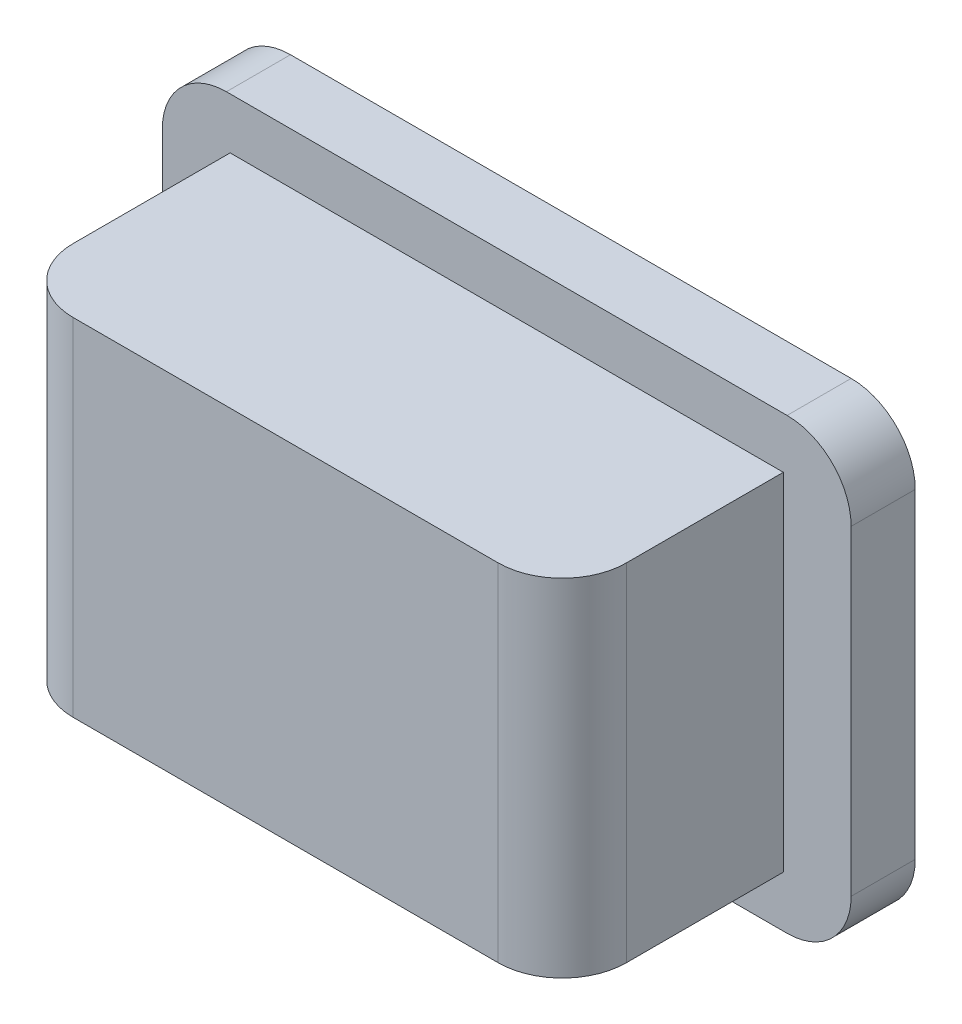
ISO-10303-21;
HEADER;
FILE_DESCRIPTION(('STEP AP214'),'2;1');
FILE_NAME('part.step','',(''),(''),'','','');
FILE_SCHEMA(('AUTOMOTIVE_DESIGN { 1 0 10303 214 1 1 1 1 }'));
ENDSEC;
DATA;
#1=APPLICATION_CONTEXT('core data for automotive mechanical design processes');
#2=APPLICATION_PROTOCOL_DEFINITION('international standard','automotive_design',2000,#1);
#3=PRODUCT_CONTEXT('',#1,'mechanical');
#4=PRODUCT('Part','Part','',(#3));
#5=PRODUCT_RELATED_PRODUCT_CATEGORY('part','',(#4));
#6=PRODUCT_DEFINITION_FORMATION('','',#4);
#7=PRODUCT_DEFINITION_CONTEXT('part definition',#1,'design');
#8=PRODUCT_DEFINITION('design','',#6,#7);
#9=PRODUCT_DEFINITION_SHAPE('','',#8);
#10=(LENGTH_UNIT() NAMED_UNIT(*) SI_UNIT(.MILLI.,.METRE.));
#11=(NAMED_UNIT(*) PLANE_ANGLE_UNIT() SI_UNIT($,.RADIAN.));
#12=(NAMED_UNIT(*) SI_UNIT($,.STERADIAN.) SOLID_ANGLE_UNIT());
#13=UNCERTAINTY_MEASURE_WITH_UNIT(LENGTH_MEASURE(1.E-05),#10,'distance_accuracy_value','');
#14=(GEOMETRIC_REPRESENTATION_CONTEXT(3) GLOBAL_UNCERTAINTY_ASSIGNED_CONTEXT((#13)) GLOBAL_UNIT_ASSIGNED_CONTEXT((#10,
#11,#12)) REPRESENTATION_CONTEXT('',''));
#15=CARTESIAN_POINT('',(0.,0.,0.));
#16=DIRECTION('',(0.,0.,1.));
#17=DIRECTION('',(1.,0.,0.));
#18=AXIS2_PLACEMENT_3D('',#15,#16,#17);
#19=CARTESIAN_POINT('',(8.74999999999987,-5.00000000000001,2.));
#20=DIRECTION('',(0.,0.,-1.));
#21=DIRECTION('',(-1.,0.,0.));
#22=AXIS2_PLACEMENT_3D('',#19,#20,#21);
#23=PLANE('',#22);
#24=CARTESIAN_POINT('',(8.74999999999987,-5.00000000000001,2.));
#25=DIRECTION('',(0.,0.,1.));
#26=DIRECTION('',(-1.,0.,0.));
#27=AXIS2_PLACEMENT_3D('',#24,#25,#26);
#28=CIRCLE('',#27,2.);
#29=CARTESIAN_POINT('',(8.74999999999986,-7.00000000000001,2.));
#30=VERTEX_POINT('',#29);
#31=CARTESIAN_POINT('',(10.7499999999999,-4.99999999999999,2.));
#32=VERTEX_POINT('',#31);
#33=EDGE_CURVE('E170',#30,#32,#28,.T.);
#34=ORIENTED_EDGE('',*,*,#33,.T.);
#35=DIRECTION('',(0.,1.,0.));
#36=VECTOR('',#35,1.);
#37=CARTESIAN_POINT('',(10.7499999999999,-4.99999999999999,2.));
#38=LINE('',#37,#36);
#39=CARTESIAN_POINT('',(10.7499999999999,4.99999999999998,2.));
#40=VERTEX_POINT('',#39);
#41=EDGE_CURVE('E173',#32,#40,#38,.T.);
#42=ORIENTED_EDGE('',*,*,#41,.T.);
#43=CARTESIAN_POINT('',(8.74999999999987,4.99999999999999,2.));
#44=DIRECTION('',(0.,0.,1.));
#45=DIRECTION('',(-1.,0.,0.));
#46=AXIS2_PLACEMENT_3D('',#43,#44,#45);
#47=CIRCLE('',#46,2.);
#48=CARTESIAN_POINT('',(8.74999999999986,6.99999999999999,2.));
#49=VERTEX_POINT('',#48);
#50=EDGE_CURVE('E176',#40,#49,#47,.T.);
#51=ORIENTED_EDGE('',*,*,#50,.T.);
#52=DIRECTION('',(-1.,0.,0.));
#53=VECTOR('',#52,1.);
#54=CARTESIAN_POINT('',(-8.75000000000008,6.99999999999999,2.));
#55=LINE('',#54,#53);
#56=CARTESIAN_POINT('',(-8.75000000000008,6.99999999999999,2.));
#57=VERTEX_POINT('',#56);
#58=EDGE_CURVE('E178',#49,#57,#55,.T.);
#59=ORIENTED_EDGE('',*,*,#58,.T.);
#60=CARTESIAN_POINT('',(-8.75000000000009,4.99999999999999,2.));
#61=DIRECTION('',(0.,0.,1.));
#62=DIRECTION('',(1.,0.,0.));
#63=AXIS2_PLACEMENT_3D('',#60,#61,#62);
#64=CIRCLE('',#63,2.);
#65=CARTESIAN_POINT('',(-10.7500000000001,4.99999999999998,2.));
#66=VERTEX_POINT('',#65);
#67=EDGE_CURVE('E180',#57,#66,#64,.T.);
#68=ORIENTED_EDGE('',*,*,#67,.T.);
#69=DIRECTION('',(0.,-1.,0.));
#70=VECTOR('',#69,1.);
#71=CARTESIAN_POINT('',(-10.7500000000001,-4.99999999999999,2.));
#72=LINE('',#71,#70);
#73=CARTESIAN_POINT('',(-10.7500000000001,-4.99999999999999,2.));
#74=VERTEX_POINT('',#73);
#75=EDGE_CURVE('E182',#66,#74,#72,.T.);
#76=ORIENTED_EDGE('',*,*,#75,.T.);
#77=CARTESIAN_POINT('',(-8.75000000000009,-5.00000000000001,2.));
#78=DIRECTION('',(0.,0.,1.));
#79=DIRECTION('',(1.,0.,0.));
#80=AXIS2_PLACEMENT_3D('',#77,#78,#79);
#81=CIRCLE('',#80,2.);
#82=CARTESIAN_POINT('',(-8.75000000000008,-7.00000000000001,2.));
#83=VERTEX_POINT('',#82);
#84=EDGE_CURVE('E184',#74,#83,#81,.T.);
#85=ORIENTED_EDGE('',*,*,#84,.T.);
#86=DIRECTION('',(1.,0.,0.));
#87=VECTOR('',#86,1.);
#88=CARTESIAN_POINT('',(-8.75000000000008,-7.00000000000001,2.));
#89=LINE('',#88,#87);
#90=EDGE_CURVE('E186',#83,#30,#89,.T.);
#91=ORIENTED_EDGE('',*,*,#90,.T.);
#92=EDGE_LOOP('',(#34,#42,#51,#59,#68,#76,#85,#91));
#93=FACE_BOUND('',#92,.T.);
#94=DIRECTION('',(0.,1.,0.));
#95=VECTOR('',#94,1.);
#96=CARTESIAN_POINT('',(8.63374956790608,-5.40437907785929,2.));
#97=LINE('',#96,#95);
#98=CARTESIAN_POINT('',(8.63374956790608,-5.40437907785929,2.));
#99=VERTEX_POINT('',#98);
#100=CARTESIAN_POINT('',(8.63374956790608,5.40437907785929,2.));
#101=VERTEX_POINT('',#100);
#102=EDGE_CURVE('E157',#99,#101,#97,.T.);
#103=ORIENTED_EDGE('',*,*,#102,.F.);
#104=DIRECTION('',(1.,0.,0.));
#105=VECTOR('',#104,1.);
#106=CARTESIAN_POINT('',(-8.63374956790608,-5.40437907785929,2.));
#107=LINE('',#106,#105);
#108=CARTESIAN_POINT('',(-8.63374956790608,-5.40437907785929,2.));
#109=VERTEX_POINT('',#108);
#110=EDGE_CURVE('E153',#109,#99,#107,.T.);
#111=ORIENTED_EDGE('',*,*,#110,.F.);
#112=DIRECTION('',(0.,-1.,0.));
#113=VECTOR('',#112,1.);
#114=CARTESIAN_POINT('',(-8.63374956790608,-5.40437907785929,2.));
#115=LINE('',#114,#113);
#116=CARTESIAN_POINT('',(-8.63374956790608,5.40437907785929,2.));
#117=VERTEX_POINT('',#116);
#118=EDGE_CURVE('E138',#117,#109,#115,.T.);
#119=ORIENTED_EDGE('',*,*,#118,.F.);
#120=DIRECTION('',(-1.,0.,0.));
#121=VECTOR('',#120,1.);
#122=CARTESIAN_POINT('',(-8.63374956790608,5.40437907785929,2.));
#123=LINE('',#122,#121);
#124=EDGE_CURVE('E150',#101,#117,#123,.T.);
#125=ORIENTED_EDGE('',*,*,#124,.F.);
#126=EDGE_LOOP('',(#103,#111,#119,#125));
#127=FACE_BOUND('',#126,.T.);
#128=ADVANCED_FACE('F34',(#93,#127),#23,.F.);
#129=CARTESIAN_POINT('',(8.74999999999987,-5.00000000000001,2.));
#130=DIRECTION('',(0.,0.,-1.));
#131=DIRECTION('',(-1.,0.,0.));
#132=AXIS2_PLACEMENT_3D('',#129,#130,#131);
#133=CYLINDRICAL_SURFACE('',#132,2.);
#134=CARTESIAN_POINT('',(8.74999999999987,-5.00000000000001,0.));
#135=DIRECTION('',(0.,0.,1.));
#136=DIRECTION('',(-1.,0.,0.));
#137=AXIS2_PLACEMENT_3D('',#134,#135,#136);
#138=CIRCLE('',#137,2.);
#139=CARTESIAN_POINT('',(8.74999999999986,-7.00000000000001,0.));
#140=VERTEX_POINT('',#139);
#141=CARTESIAN_POINT('',(10.7499999999999,-4.99999999999999,0.));
#142=VERTEX_POINT('',#141);
#143=EDGE_CURVE('E169',#140,#142,#138,.T.);
#144=ORIENTED_EDGE('',*,*,#143,.T.);
#145=DIRECTION('',(0.,0.,-1.));
#146=VECTOR('',#145,1.);
#147=CARTESIAN_POINT('',(10.7499999999999,-4.99999999999999,2.));
#148=LINE('',#147,#146);
#149=EDGE_CURVE('E224',#32,#142,#148,.T.);
#150=ORIENTED_EDGE('',*,*,#149,.F.);
#151=ORIENTED_EDGE('',*,*,#33,.F.);
#152=DIRECTION('',(0.,0.,-1.));
#153=VECTOR('',#152,1.);
#154=CARTESIAN_POINT('',(8.74999999999986,-7.00000000000001,2.));
#155=LINE('',#154,#153);
#156=EDGE_CURVE('E188',#30,#140,#155,.T.);
#157=ORIENTED_EDGE('',*,*,#156,.T.);
#158=EDGE_LOOP('',(#144,#150,#151,#157));
#159=FACE_BOUND('',#158,.T.);
#160=ADVANCED_FACE('F256',(#159),#133,.T.);
#161=CARTESIAN_POINT('',(10.7499999999999,-4.99999999999999,2.));
#162=DIRECTION('',(-1.,0.,0.));
#163=DIRECTION('',(0.,0.,1.));
#164=AXIS2_PLACEMENT_3D('',#161,#162,#163);
#165=PLANE('',#164);
#166=DIRECTION('',(0.,1.,0.));
#167=VECTOR('',#166,1.);
#168=CARTESIAN_POINT('',(10.7499999999999,-4.99999999999999,0.));
#169=LINE('',#168,#167);
#170=CARTESIAN_POINT('',(10.7499999999999,4.99999999999998,0.));
#171=VERTEX_POINT('',#170);
#172=EDGE_CURVE('E191',#142,#171,#169,.T.);
#173=ORIENTED_EDGE('',*,*,#172,.T.);
#174=DIRECTION('',(0.,0.,-1.));
#175=VECTOR('',#174,1.);
#176=CARTESIAN_POINT('',(10.7499999999999,4.99999999999998,2.));
#177=LINE('',#176,#175);
#178=EDGE_CURVE('E221',#40,#171,#177,.T.);
#179=ORIENTED_EDGE('',*,*,#178,.F.);
#180=ORIENTED_EDGE('',*,*,#41,.F.);
#181=ORIENTED_EDGE('',*,*,#149,.T.);
#182=EDGE_LOOP('',(#173,#179,#180,#181));
#183=FACE_BOUND('',#182,.T.);
#184=ADVANCED_FACE('F262',(#183),#165,.F.);
#185=CARTESIAN_POINT('',(8.74999999999987,4.99999999999999,2.));
#186=DIRECTION('',(0.,0.,-1.));
#187=DIRECTION('',(-1.,0.,0.));
#188=AXIS2_PLACEMENT_3D('',#185,#186,#187);
#189=CYLINDRICAL_SURFACE('',#188,2.);
#190=CARTESIAN_POINT('',(8.74999999999987,4.99999999999999,0.));
#191=DIRECTION('',(0.,0.,1.));
#192=DIRECTION('',(-1.,0.,0.));
#193=AXIS2_PLACEMENT_3D('',#190,#191,#192);
#194=CIRCLE('',#193,2.);
#195=CARTESIAN_POINT('',(8.74999999999986,6.99999999999999,0.));
#196=VERTEX_POINT('',#195);
#197=EDGE_CURVE('E193',#171,#196,#194,.T.);
#198=ORIENTED_EDGE('',*,*,#197,.T.);
#199=DIRECTION('',(0.,0.,-1.));
#200=VECTOR('',#199,1.);
#201=CARTESIAN_POINT('',(8.74999999999986,6.99999999999999,2.));
#202=LINE('',#201,#200);
#203=EDGE_CURVE('E218',#49,#196,#202,.T.);
#204=ORIENTED_EDGE('',*,*,#203,.F.);
#205=ORIENTED_EDGE('',*,*,#50,.F.);
#206=ORIENTED_EDGE('',*,*,#178,.T.);
#207=EDGE_LOOP('',(#198,#204,#205,#206));
#208=FACE_BOUND('',#207,.T.);
#209=ADVANCED_FACE('F291',(#208),#189,.T.);
#210=CARTESIAN_POINT('',(-8.75000000000008,6.99999999999999,2.));
#211=DIRECTION('',(0.,-1.,0.));
#212=DIRECTION('',(0.,0.,-1.));
#213=AXIS2_PLACEMENT_3D('',#210,#211,#212);
#214=PLANE('',#213);
#215=DIRECTION('',(-1.,0.,0.));
#216=VECTOR('',#215,1.);
#217=CARTESIAN_POINT('',(-8.75000000000008,6.99999999999999,0.));
#218=LINE('',#217,#216);
#219=CARTESIAN_POINT('',(-8.75000000000008,6.99999999999999,0.));
#220=VERTEX_POINT('',#219);
#221=EDGE_CURVE('E195',#196,#220,#218,.T.);
#222=ORIENTED_EDGE('',*,*,#221,.T.);
#223=DIRECTION('',(0.,0.,-1.));
#224=VECTOR('',#223,1.);
#225=CARTESIAN_POINT('',(-8.75000000000008,6.99999999999999,2.));
#226=LINE('',#225,#224);
#227=EDGE_CURVE('E215',#57,#220,#226,.T.);
#228=ORIENTED_EDGE('',*,*,#227,.F.);
#229=ORIENTED_EDGE('',*,*,#58,.F.);
#230=ORIENTED_EDGE('',*,*,#203,.T.);
#231=EDGE_LOOP('',(#222,#228,#229,#230));
#232=FACE_BOUND('',#231,.T.);
#233=ADVANCED_FACE('F287',(#232),#214,.F.);
#234=CARTESIAN_POINT('',(-8.75000000000009,4.99999999999999,2.));
#235=DIRECTION('',(0.,0.,-1.));
#236=DIRECTION('',(-1.,0.,0.));
#237=AXIS2_PLACEMENT_3D('',#234,#235,#236);
#238=CYLINDRICAL_SURFACE('',#237,2.);
#239=CARTESIAN_POINT('',(-8.75000000000009,4.99999999999999,0.));
#240=DIRECTION('',(0.,0.,1.));
#241=DIRECTION('',(1.,0.,0.));
#242=AXIS2_PLACEMENT_3D('',#239,#240,#241);
#243=CIRCLE('',#242,2.);
#244=CARTESIAN_POINT('',(-10.7500000000001,4.99999999999998,0.));
#245=VERTEX_POINT('',#244);
#246=EDGE_CURVE('E197',#220,#245,#243,.T.);
#247=ORIENTED_EDGE('',*,*,#246,.T.);
#248=DIRECTION('',(0.,0.,-1.));
#249=VECTOR('',#248,1.);
#250=CARTESIAN_POINT('',(-10.7500000000001,4.99999999999998,2.));
#251=LINE('',#250,#249);
#252=EDGE_CURVE('E212',#66,#245,#251,.T.);
#253=ORIENTED_EDGE('',*,*,#252,.F.);
#254=ORIENTED_EDGE('',*,*,#67,.F.);
#255=ORIENTED_EDGE('',*,*,#227,.T.);
#256=EDGE_LOOP('',(#247,#253,#254,#255));
#257=FACE_BOUND('',#256,.T.);
#258=ADVANCED_FACE('F283',(#257),#238,.T.);
#259=CARTESIAN_POINT('',(-10.7500000000001,-4.99999999999999,2.));
#260=DIRECTION('',(1.,0.,0.));
#261=DIRECTION('',(0.,0.,-1.));
#262=AXIS2_PLACEMENT_3D('',#259,#260,#261);
#263=PLANE('',#262);
#264=DIRECTION('',(0.,-1.,0.));
#265=VECTOR('',#264,1.);
#266=CARTESIAN_POINT('',(-10.7500000000001,-4.99999999999999,0.));
#267=LINE('',#266,#265);
#268=CARTESIAN_POINT('',(-10.7500000000001,-4.99999999999999,0.));
#269=VERTEX_POINT('',#268);
#270=EDGE_CURVE('E199',#245,#269,#267,.T.);
#271=ORIENTED_EDGE('',*,*,#270,.T.);
#272=DIRECTION('',(0.,0.,-1.));
#273=VECTOR('',#272,1.);
#274=CARTESIAN_POINT('',(-10.7500000000001,-4.99999999999999,2.));
#275=LINE('',#274,#273);
#276=EDGE_CURVE('E209',#74,#269,#275,.T.);
#277=ORIENTED_EDGE('',*,*,#276,.F.);
#278=ORIENTED_EDGE('',*,*,#75,.F.);
#279=ORIENTED_EDGE('',*,*,#252,.T.);
#280=EDGE_LOOP('',(#271,#277,#278,#279));
#281=FACE_BOUND('',#280,.T.);
#282=ADVANCED_FACE('F279',(#281),#263,.F.);
#283=CARTESIAN_POINT('',(-8.75000000000009,-5.00000000000001,2.));
#284=DIRECTION('',(0.,0.,-1.));
#285=DIRECTION('',(-1.,0.,0.));
#286=AXIS2_PLACEMENT_3D('',#283,#284,#285);
#287=CYLINDRICAL_SURFACE('',#286,2.);
#288=CARTESIAN_POINT('',(-8.75000000000009,-5.00000000000001,0.));
#289=DIRECTION('',(0.,0.,1.));
#290=DIRECTION('',(1.,0.,0.));
#291=AXIS2_PLACEMENT_3D('',#288,#289,#290);
#292=CIRCLE('',#291,2.);
#293=CARTESIAN_POINT('',(-8.75000000000008,-7.00000000000001,0.));
#294=VERTEX_POINT('',#293);
#295=EDGE_CURVE('E201',#269,#294,#292,.T.);
#296=ORIENTED_EDGE('',*,*,#295,.T.);
#297=DIRECTION('',(0.,0.,-1.));
#298=VECTOR('',#297,1.);
#299=CARTESIAN_POINT('',(-8.75000000000008,-7.00000000000001,2.));
#300=LINE('',#299,#298);
#301=EDGE_CURVE('E206',#83,#294,#300,.T.);
#302=ORIENTED_EDGE('',*,*,#301,.F.);
#303=ORIENTED_EDGE('',*,*,#84,.F.);
#304=ORIENTED_EDGE('',*,*,#276,.T.);
#305=EDGE_LOOP('',(#296,#302,#303,#304));
#306=FACE_BOUND('',#305,.T.);
#307=ADVANCED_FACE('F275',(#306),#287,.T.);
#308=CARTESIAN_POINT('',(-8.75000000000008,-7.00000000000001,2.));
#309=DIRECTION('',(0.,1.,0.));
#310=DIRECTION('',(0.,0.,1.));
#311=AXIS2_PLACEMENT_3D('',#308,#309,#310);
#312=PLANE('',#311);
#313=DIRECTION('',(1.,0.,0.));
#314=VECTOR('',#313,1.);
#315=CARTESIAN_POINT('',(-8.75000000000008,-7.00000000000001,0.));
#316=LINE('',#315,#314);
#317=EDGE_CURVE('E174',#294,#140,#316,.T.);
#318=ORIENTED_EDGE('',*,*,#317,.T.);
#319=ORIENTED_EDGE('',*,*,#156,.F.);
#320=ORIENTED_EDGE('',*,*,#90,.F.);
#321=ORIENTED_EDGE('',*,*,#301,.T.);
#322=EDGE_LOOP('',(#318,#319,#320,#321));
#323=FACE_BOUND('',#322,.T.);
#324=ADVANCED_FACE('F271',(#323),#312,.F.);
#325=CARTESIAN_POINT('',(8.74999999999987,-5.00000000000001,0.));
#326=DIRECTION('',(0.,0.,-1.));
#327=DIRECTION('',(-1.,0.,0.));
#328=AXIS2_PLACEMENT_3D('',#325,#326,#327);
#329=PLANE('',#328);
#330=ORIENTED_EDGE('',*,*,#143,.F.);
#331=ORIENTED_EDGE('',*,*,#317,.F.);
#332=ORIENTED_EDGE('',*,*,#295,.F.);
#333=ORIENTED_EDGE('',*,*,#270,.F.);
#334=ORIENTED_EDGE('',*,*,#246,.F.);
#335=ORIENTED_EDGE('',*,*,#221,.F.);
#336=ORIENTED_EDGE('',*,*,#197,.F.);
#337=ORIENTED_EDGE('',*,*,#172,.F.);
#338=EDGE_LOOP('',(#330,#331,#332,#333,#334,#335,#336,#337));
#339=FACE_BOUND('',#338,.T.);
#340=ADVANCED_FACE('F268',(#339),#329,.T.);
#341=CARTESIAN_POINT('',(8.63374956790608,-5.40437907785929,8.9));
#342=DIRECTION('',(-1.,0.,0.));
#343=DIRECTION('',(0.,0.,1.));
#344=AXIS2_PLACEMENT_3D('',#341,#342,#343);
#345=PLANE('',#344);
#346=DIRECTION('',(0.,0.,-1.));
#347=VECTOR('',#346,1.);
#348=CARTESIAN_POINT('',(8.63374956790608,5.40437907785929,8.9));
#349=LINE('',#348,#347);
#350=CARTESIAN_POINT('',(8.63374956790608,5.40437907785929,6.9));
#351=VERTEX_POINT('',#350);
#352=EDGE_CURVE('E143',#351,#101,#349,.T.);
#353=ORIENTED_EDGE('',*,*,#352,.F.);
#354=DIRECTION('',(0.,1.,0.));
#355=VECTOR('',#354,1.);
#356=CARTESIAN_POINT('',(8.63374956790608,-5.40437907785929,6.9));
#357=LINE('',#356,#355);
#358=CARTESIAN_POINT('',(8.63374956790608,-5.40437907785929,6.9));
#359=VERTEX_POINT('',#358);
#360=EDGE_CURVE('E57',#351,#359,#357,.F.);
#361=ORIENTED_EDGE('',*,*,#360,.T.);
#362=DIRECTION('',(0.,0.,-1.));
#363=VECTOR('',#362,1.);
#364=CARTESIAN_POINT('',(8.63374956790608,-5.40437907785929,8.9));
#365=LINE('',#364,#363);
#366=EDGE_CURVE('E164',#359,#99,#365,.T.);
#367=ORIENTED_EDGE('',*,*,#366,.T.);
#368=ORIENTED_EDGE('',*,*,#102,.T.);
#369=EDGE_LOOP('',(#353,#361,#367,#368));
#370=FACE_BOUND('',#369,.T.);
#371=ADVANCED_FACE('F248',(#370),#345,.F.);
#372=CARTESIAN_POINT('',(-8.63374956790608,5.40437907785929,8.9));
#373=DIRECTION('',(0.,-1.,0.));
#374=DIRECTION('',(0.,0.,-1.));
#375=AXIS2_PLACEMENT_3D('',#372,#373,#374);
#376=PLANE('',#375);
#377=DIRECTION('',(-1.,0.,0.));
#378=VECTOR('',#377,1.);
#379=CARTESIAN_POINT('',(-8.63374956790608,5.40437907785929,8.9));
#380=LINE('',#379,#378);
#381=CARTESIAN_POINT('',(6.63374956790608,5.40437907785929,8.9));
#382=VERTEX_POINT('',#381);
#383=CARTESIAN_POINT('',(-6.63374956790608,5.40437907785929,8.9));
#384=VERTEX_POINT('',#383);
#385=EDGE_CURVE('E163',#382,#384,#380,.T.);
#386=ORIENTED_EDGE('',*,*,#385,.F.);
#387=CARTESIAN_POINT('',(6.63374956790608,5.40437907785929,6.9));
#388=DIRECTION('',(0.,-1.,0.));
#389=DIRECTION('',(0.,0.,-1.));
#390=AXIS2_PLACEMENT_3D('',#387,#388,#389);
#391=CIRCLE('',#390,2.);
#392=EDGE_CURVE('E235',#382,#351,#391,.F.);
#393=ORIENTED_EDGE('',*,*,#392,.T.);
#394=ORIENTED_EDGE('',*,*,#352,.T.);
#395=ORIENTED_EDGE('',*,*,#124,.T.);
#396=DIRECTION('',(0.,0.,-1.));
#397=VECTOR('',#396,1.);
#398=CARTESIAN_POINT('',(-8.63374956790608,5.40437907785929,8.9));
#399=LINE('',#398,#397);
#400=CARTESIAN_POINT('',(-8.63374956790608,5.40437907785929,6.9));
#401=VERTEX_POINT('',#400);
#402=EDGE_CURVE('E135',#401,#117,#399,.T.);
#403=ORIENTED_EDGE('',*,*,#402,.F.);
#404=CARTESIAN_POINT('',(-6.63374956790608,5.40437907785929,6.9));
#405=DIRECTION('',(0.,-1.,0.));
#406=DIRECTION('',(0.,0.,-1.));
#407=AXIS2_PLACEMENT_3D('',#404,#405,#406);
#408=CIRCLE('',#407,2.);
#409=EDGE_CURVE('E233',#401,#384,#408,.F.);
#410=ORIENTED_EDGE('',*,*,#409,.T.);
#411=EDGE_LOOP('',(#386,#393,#394,#395,#403,#410));
#412=FACE_BOUND('',#411,.T.);
#413=ADVANCED_FACE('F156',(#412),#376,.F.);
#414=CARTESIAN_POINT('',(-8.63374956790608,-5.40437907785929,8.9));
#415=DIRECTION('',(1.,0.,0.));
#416=DIRECTION('',(0.,0.,-1.));
#417=AXIS2_PLACEMENT_3D('',#414,#415,#416);
#418=PLANE('',#417);
#419=DIRECTION('',(0.,0.,-1.));
#420=VECTOR('',#419,1.);
#421=CARTESIAN_POINT('',(-8.63374956790608,-5.40437907785929,8.9));
#422=LINE('',#421,#420);
#423=CARTESIAN_POINT('',(-8.63374956790608,-5.40437907785929,6.9));
#424=VERTEX_POINT('',#423);
#425=EDGE_CURVE('E144',#424,#109,#422,.T.);
#426=ORIENTED_EDGE('',*,*,#425,.F.);
#427=DIRECTION('',(0.,-1.,0.));
#428=VECTOR('',#427,1.);
#429=CARTESIAN_POINT('',(-8.63374956790608,-5.40437907785929,6.9));
#430=LINE('',#429,#428);
#431=EDGE_CURVE('E11',#424,#401,#430,.F.);
#432=ORIENTED_EDGE('',*,*,#431,.T.);
#433=ORIENTED_EDGE('',*,*,#402,.T.);
#434=ORIENTED_EDGE('',*,*,#118,.T.);
#435=EDGE_LOOP('',(#426,#432,#433,#434));
#436=FACE_BOUND('',#435,.T.);
#437=ADVANCED_FACE('F137',(#436),#418,.F.);
#438=CARTESIAN_POINT('',(-8.63374956790608,-5.40437907785929,8.9));
#439=DIRECTION('',(0.,1.,0.));
#440=DIRECTION('',(0.,0.,1.));
#441=AXIS2_PLACEMENT_3D('',#438,#439,#440);
#442=PLANE('',#441);
#443=ORIENTED_EDGE('',*,*,#366,.F.);
#444=CARTESIAN_POINT('',(6.63374956790608,-5.40437907785929,6.9));
#445=DIRECTION('',(0.,1.,0.));
#446=DIRECTION('',(0.,0.,1.));
#447=AXIS2_PLACEMENT_3D('',#444,#445,#446);
#448=CIRCLE('',#447,2.);
#449=CARTESIAN_POINT('',(6.63374956790608,-5.40437907785929,8.9));
#450=VERTEX_POINT('',#449);
#451=EDGE_CURVE('E42',#359,#450,#448,.F.);
#452=ORIENTED_EDGE('',*,*,#451,.T.);
#453=DIRECTION('',(1.,0.,0.));
#454=VECTOR('',#453,1.);
#455=CARTESIAN_POINT('',(-8.63374956790608,-5.40437907785929,8.9));
#456=LINE('',#455,#454);
#457=CARTESIAN_POINT('',(-6.63374956790608,-5.40437907785929,8.9));
#458=VERTEX_POINT('',#457);
#459=EDGE_CURVE('E166',#458,#450,#456,.T.);
#460=ORIENTED_EDGE('',*,*,#459,.F.);
#461=CARTESIAN_POINT('',(-6.63374956790608,-5.40437907785929,6.9));
#462=DIRECTION('',(0.,1.,0.));
#463=DIRECTION('',(0.,0.,1.));
#464=AXIS2_PLACEMENT_3D('',#461,#462,#463);
#465=CIRCLE('',#464,2.);
#466=EDGE_CURVE('E49',#458,#424,#465,.F.);
#467=ORIENTED_EDGE('',*,*,#466,.T.);
#468=ORIENTED_EDGE('',*,*,#425,.T.);
#469=ORIENTED_EDGE('',*,*,#110,.T.);
#470=EDGE_LOOP('',(#443,#452,#460,#467,#468,#469));
#471=FACE_BOUND('',#470,.T.);
#472=ADVANCED_FACE('F240',(#471),#442,.F.);
#473=CARTESIAN_POINT('',(0.,0.,8.9));
#474=DIRECTION('',(0.,0.,-1.));
#475=DIRECTION('',(-1.,0.,0.));
#476=AXIS2_PLACEMENT_3D('',#473,#474,#475);
#477=PLANE('',#476);
#478=ORIENTED_EDGE('',*,*,#459,.T.);
#479=DIRECTION('',(0.,1.,0.));
#480=VECTOR('',#479,1.);
#481=CARTESIAN_POINT('',(6.63374956790608,0.,8.9));
#482=LINE('',#481,#480);
#483=EDGE_CURVE('E230',#450,#382,#482,.T.);
#484=ORIENTED_EDGE('',*,*,#483,.T.);
#485=ORIENTED_EDGE('',*,*,#385,.T.);
#486=DIRECTION('',(0.,-1.,0.));
#487=VECTOR('',#486,1.);
#488=CARTESIAN_POINT('',(-6.63374956790608,0.,8.9));
#489=LINE('',#488,#487);
#490=EDGE_CURVE('E227',#384,#458,#489,.T.);
#491=ORIENTED_EDGE('',*,*,#490,.T.);
#492=EDGE_LOOP('',(#478,#484,#485,#491));
#493=FACE_BOUND('',#492,.T.);
#494=ADVANCED_FACE('F244',(#493),#477,.F.);
#495=CARTESIAN_POINT('',(6.63374956790608,0.,6.9));
#496=DIRECTION('',(0.,1.,0.));
#497=DIRECTION('',(0.,0.,1.));
#498=AXIS2_PLACEMENT_3D('',#495,#496,#497);
#499=CYLINDRICAL_SURFACE('',#498,2.);
#500=ORIENTED_EDGE('',*,*,#451,.F.);
#501=ORIENTED_EDGE('',*,*,#360,.F.);
#502=ORIENTED_EDGE('',*,*,#392,.F.);
#503=ORIENTED_EDGE('',*,*,#483,.F.);
#504=EDGE_LOOP('',(#500,#501,#502,#503));
#505=FACE_BOUND('',#504,.T.);
#506=ADVANCED_FACE('F247',(#505),#499,.T.);
#507=CARTESIAN_POINT('',(-6.63374956790608,0.,6.9));
#508=DIRECTION('',(0.,-1.,0.));
#509=DIRECTION('',(0.,0.,-1.));
#510=AXIS2_PLACEMENT_3D('',#507,#508,#509);
#511=CYLINDRICAL_SURFACE('',#510,2.);
#512=ORIENTED_EDGE('',*,*,#409,.F.);
#513=ORIENTED_EDGE('',*,*,#431,.F.);
#514=ORIENTED_EDGE('',*,*,#466,.F.);
#515=ORIENTED_EDGE('',*,*,#490,.F.);
#516=EDGE_LOOP('',(#512,#513,#514,#515));
#517=FACE_BOUND('',#516,.T.);
#518=ADVANCED_FACE('F36',(#517),#511,.T.);
#519=CLOSED_SHELL('',(#128,#160,#184,#209,#233,#258,#282,#307,#324,#340,#371,#413,#437,#472,
#494,#506,#518));
#520=MANIFOLD_SOLID_BREP('B2',#519);
#521=ADVANCED_BREP_SHAPE_REPRESENTATION('',(#18,#520),#14);
#522=SHAPE_DEFINITION_REPRESENTATION(#9,#521);
ENDSEC;
END-ISO-10303-21;
